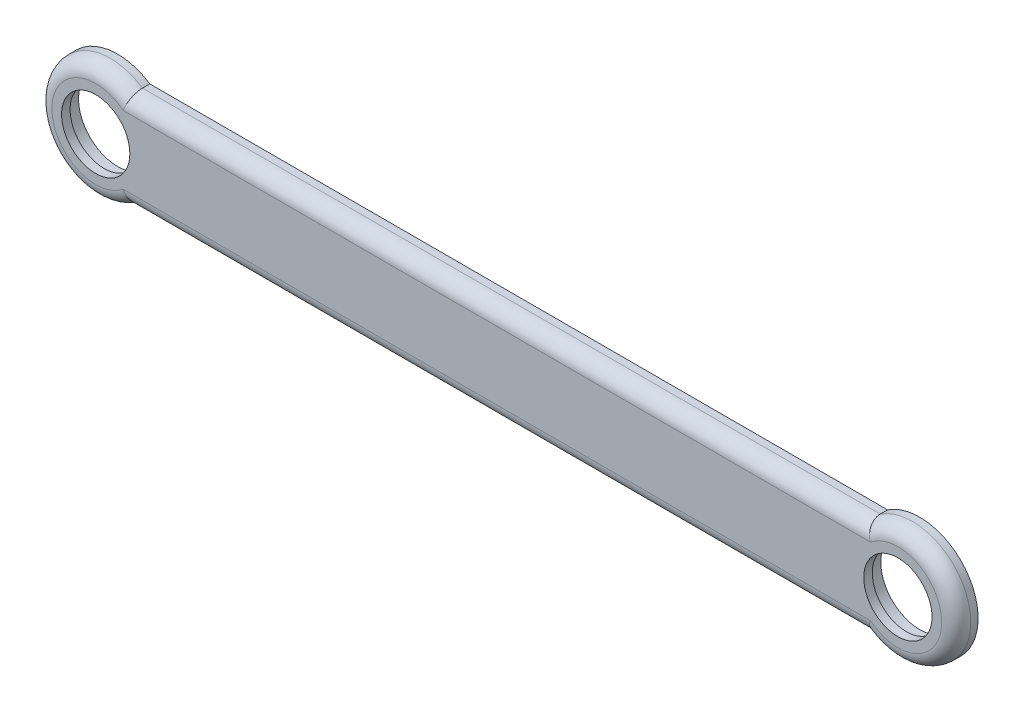
ISO-10303-21;
HEADER;
FILE_DESCRIPTION(('STEP AP214'),'2;1');
FILE_NAME('part.step','',(''),(''),'','','');
FILE_SCHEMA(('AUTOMOTIVE_DESIGN { 1 0 10303 214 1 1 1 1 }'));
ENDSEC;
DATA;
#1=APPLICATION_CONTEXT('core data for automotive mechanical design processes');
#2=APPLICATION_PROTOCOL_DEFINITION('international standard','automotive_design',2000,#1);
#3=PRODUCT_CONTEXT('',#1,'mechanical');
#4=PRODUCT('Part','Part','',(#3));
#5=PRODUCT_RELATED_PRODUCT_CATEGORY('part','',(#4));
#6=PRODUCT_DEFINITION_FORMATION('','',#4);
#7=PRODUCT_DEFINITION_CONTEXT('part definition',#1,'design');
#8=PRODUCT_DEFINITION('design','',#6,#7);
#9=PRODUCT_DEFINITION_SHAPE('','',#8);
#10=(LENGTH_UNIT() NAMED_UNIT(*) SI_UNIT(.MILLI.,.METRE.));
#11=(NAMED_UNIT(*) PLANE_ANGLE_UNIT() SI_UNIT($,.RADIAN.));
#12=(NAMED_UNIT(*) SI_UNIT($,.STERADIAN.) SOLID_ANGLE_UNIT());
#13=UNCERTAINTY_MEASURE_WITH_UNIT(LENGTH_MEASURE(1.E-05),#10,'distance_accuracy_value','');
#14=(GEOMETRIC_REPRESENTATION_CONTEXT(3) GLOBAL_UNCERTAINTY_ASSIGNED_CONTEXT((#13)) GLOBAL_UNIT_ASSIGNED_CONTEXT((#10,
#11,#12)) REPRESENTATION_CONTEXT('',''));
#15=CARTESIAN_POINT('',(0.,0.,0.));
#16=DIRECTION('',(0.,0.,1.));
#17=DIRECTION('',(1.,0.,0.));
#18=AXIS2_PLACEMENT_3D('',#15,#16,#17);
#19=CARTESIAN_POINT('',(0.,0.,0.));
#20=DIRECTION('',(0.,0.,1.));
#21=DIRECTION('',(1.,0.,0.));
#22=AXIS2_PLACEMENT_3D('',#19,#20,#21);
#23=PLANE('',#22);
#24=CARTESIAN_POINT('',(165.,0.,0.));
#25=DIRECTION('',(0.,0.,1.));
#26=DIRECTION('',(1.,0.,0.));
#27=AXIS2_PLACEMENT_3D('',#24,#25,#26);
#28=CIRCLE('',#27,8.025);
#29=CARTESIAN_POINT('',(173.025,0.,0.));
#30=VERTEX_POINT('',#29);
#31=EDGE_CURVE('E175',#30,#30,#28,.F.);
#32=ORIENTED_EDGE('',*,*,#31,.F.);
#33=EDGE_LOOP('',(#32));
#34=FACE_BOUND('',#33,.T.);
#35=CARTESIAN_POINT('',(0.,0.,0.));
#36=DIRECTION('',(0.,0.,1.));
#37=DIRECTION('',(1.,0.,0.));
#38=AXIS2_PLACEMENT_3D('',#35,#36,#37);
#39=CIRCLE('',#38,8.025);
#40=CARTESIAN_POINT('',(8.025,0.,0.));
#41=VERTEX_POINT('',#40);
#42=EDGE_CURVE('E11',#41,#41,#39,.T.);
#43=ORIENTED_EDGE('',*,*,#42,.T.);
#44=EDGE_LOOP('',(#43));
#45=FACE_BOUND('',#44,.T.);
#46=DIRECTION('',(1.,0.,0.));
#47=VECTOR('',#46,1.);
#48=CARTESIAN_POINT('',(6.6332495807108,10.,0.));
#49=LINE('',#48,#47);
#50=CARTESIAN_POINT('',(6.6332495807108,10.,0.));
#51=VERTEX_POINT('',#50);
#52=CARTESIAN_POINT('',(158.366750419289,10.,0.));
#53=VERTEX_POINT('',#52);
#54=EDGE_CURVE('E51',#51,#53,#49,.T.);
#55=ORIENTED_EDGE('',*,*,#54,.T.);
#56=CARTESIAN_POINT('',(165.,0.,0.));
#57=DIRECTION('',(0.,0.,1.));
#58=DIRECTION('',(1.,0.,0.));
#59=AXIS2_PLACEMENT_3D('',#56,#57,#58);
#60=CIRCLE('',#59,12.);
#61=CARTESIAN_POINT('',(158.366750419289,-10.,0.));
#62=VERTEX_POINT('',#61);
#63=EDGE_CURVE('E56',#53,#62,#60,.F.);
#64=ORIENTED_EDGE('',*,*,#63,.T.);
#65=DIRECTION('',(1.,0.,0.));
#66=VECTOR('',#65,1.);
#67=CARTESIAN_POINT('',(6.6332495807108,-10.,0.));
#68=LINE('',#67,#66);
#69=CARTESIAN_POINT('',(6.6332495807108,-10.,0.));
#70=VERTEX_POINT('',#69);
#71=EDGE_CURVE('E172',#70,#62,#68,.T.);
#72=ORIENTED_EDGE('',*,*,#71,.F.);
#73=CARTESIAN_POINT('',(0.,0.,0.));
#74=DIRECTION('',(0.,0.,1.));
#75=DIRECTION('',(1.,0.,0.));
#76=AXIS2_PLACEMENT_3D('',#73,#74,#75);
#77=CIRCLE('',#76,12.);
#78=EDGE_CURVE('E46',#51,#70,#77,.T.);
#79=ORIENTED_EDGE('',*,*,#78,.F.);
#80=EDGE_LOOP('',(#55,#64,#72,#79));
#81=FACE_BOUND('',#80,.T.);
#82=ADVANCED_FACE('F43',(#34,#45,#81),#23,.F.);
#83=CARTESIAN_POINT('',(0.,0.,4.5));
#84=DIRECTION('',(0.,0.,1.));
#85=DIRECTION('',(1.,0.,0.));
#86=AXIS2_PLACEMENT_3D('',#83,#84,#85);
#87=PLANE('',#86);
#88=CARTESIAN_POINT('',(0.,0.,4.5));
#89=DIRECTION('',(0.,0.,1.));
#90=DIRECTION('',(1.,0.,0.));
#91=AXIS2_PLACEMENT_3D('',#88,#89,#90);
#92=CIRCLE('',#91,9.);
#93=CARTESIAN_POINT('',(5.65685424949238,7.,4.5));
#94=VERTEX_POINT('',#93);
#95=CARTESIAN_POINT('',(5.65685424949238,-7.,4.5));
#96=VERTEX_POINT('',#95);
#97=EDGE_CURVE('E195',#94,#96,#92,.T.);
#98=ORIENTED_EDGE('',*,*,#97,.T.);
#99=DIRECTION('',(1.,0.,0.));
#100=VECTOR('',#99,1.);
#101=CARTESIAN_POINT('',(158.366750419289,-7.00000000000002,4.5));
#102=LINE('',#101,#100);
#103=CARTESIAN_POINT('',(159.343145750508,-7.00000000000001,4.5));
#104=VERTEX_POINT('',#103);
#105=EDGE_CURVE('E126',#96,#104,#102,.T.);
#106=ORIENTED_EDGE('',*,*,#105,.T.);
#107=CARTESIAN_POINT('',(165.,0.,4.5));
#108=DIRECTION('',(0.,0.,1.));
#109=DIRECTION('',(1.,0.,0.));
#110=AXIS2_PLACEMENT_3D('',#107,#108,#109);
#111=CIRCLE('',#110,9.00000000000003);
#112=CARTESIAN_POINT('',(159.343145750508,7.00000000000002,4.5));
#113=VERTEX_POINT('',#112);
#114=EDGE_CURVE('E192',#104,#113,#111,.T.);
#115=ORIENTED_EDGE('',*,*,#114,.T.);
#116=DIRECTION('',(1.,0.,0.));
#117=VECTOR('',#116,1.);
#118=CARTESIAN_POINT('',(0.,7.,4.5));
#119=LINE('',#118,#117);
#120=EDGE_CURVE('E188',#113,#94,#119,.F.);
#121=ORIENTED_EDGE('',*,*,#120,.T.);
#122=EDGE_LOOP('',(#98,#106,#115,#121));
#123=FACE_BOUND('',#122,.T.);
#124=CARTESIAN_POINT('',(165.,0.,4.5));
#125=DIRECTION('',(0.,0.,-1.));
#126=DIRECTION('',(-1.,0.,0.));
#127=AXIS2_PLACEMENT_3D('',#124,#125,#126);
#128=CIRCLE('',#127,7.025);
#129=CARTESIAN_POINT('',(157.975,0.,4.5));
#130=VERTEX_POINT('',#129);
#131=EDGE_CURVE('E168',#130,#130,#128,.T.);
#132=ORIENTED_EDGE('',*,*,#131,.T.);
#133=EDGE_LOOP('',(#132));
#134=FACE_BOUND('',#133,.T.);
#135=CARTESIAN_POINT('',(0.,0.,4.5));
#136=DIRECTION('',(0.,0.,1.));
#137=DIRECTION('',(1.,0.,0.));
#138=AXIS2_PLACEMENT_3D('',#135,#136,#137);
#139=CIRCLE('',#138,7.025);
#140=CARTESIAN_POINT('',(7.025,0.,4.5));
#141=VERTEX_POINT('',#140);
#142=EDGE_CURVE('E214',#141,#141,#139,.T.);
#143=ORIENTED_EDGE('',*,*,#142,.F.);
#144=EDGE_LOOP('',(#143));
#145=FACE_BOUND('',#144,.T.);
#146=ADVANCED_FACE('F193',(#123,#134,#145),#87,.T.);
#147=CARTESIAN_POINT('',(0.,0.,4.5));
#148=DIRECTION('',(0.,0.,-1.));
#149=DIRECTION('',(-1.,0.,0.));
#150=AXIS2_PLACEMENT_3D('',#147,#148,#149);
#151=CYLINDRICAL_SURFACE('',#150,12.);
#152=DIRECTION('',(0.,0.,-1.));
#153=VECTOR('',#152,1.);
#154=CARTESIAN_POINT('',(6.6332495807108,10.,4.5));
#155=LINE('',#154,#153);
#156=CARTESIAN_POINT('',(6.6332495807108,10.,1.5));
#157=VERTEX_POINT('',#156);
#158=EDGE_CURVE('E183',#157,#51,#155,.T.);
#159=ORIENTED_EDGE('',*,*,#158,.T.);
#160=ORIENTED_EDGE('',*,*,#78,.T.);
#161=DIRECTION('',(0.,0.,-1.));
#162=VECTOR('',#161,1.);
#163=CARTESIAN_POINT('',(6.6332495807108,-10.,4.5));
#164=LINE('',#163,#162);
#165=CARTESIAN_POINT('',(6.6332495807108,-10.,1.5));
#166=VERTEX_POINT('',#165);
#167=EDGE_CURVE('E105',#166,#70,#164,.T.);
#168=ORIENTED_EDGE('',*,*,#167,.F.);
#169=CARTESIAN_POINT('',(0.,0.,1.5));
#170=DIRECTION('',(0.,0.,1.));
#171=DIRECTION('',(1.,0.,0.));
#172=AXIS2_PLACEMENT_3D('',#169,#170,#171);
#173=CIRCLE('',#172,12.);
#174=EDGE_CURVE('E106',#166,#157,#173,.F.);
#175=ORIENTED_EDGE('',*,*,#174,.T.);
#176=EDGE_LOOP('',(#159,#160,#168,#175));
#177=FACE_BOUND('',#176,.T.);
#178=ADVANCED_FACE('F113',(#177),#151,.T.);
#179=CARTESIAN_POINT('',(6.6332495807108,-10.,4.5));
#180=DIRECTION('',(0.,1.,0.));
#181=DIRECTION('',(-1.,0.,0.));
#182=AXIS2_PLACEMENT_3D('',#179,#180,#181);
#183=PLANE('',#182);
#184=ORIENTED_EDGE('',*,*,#167,.T.);
#185=ORIENTED_EDGE('',*,*,#71,.T.);
#186=DIRECTION('',(0.,0.,-1.));
#187=VECTOR('',#186,1.);
#188=CARTESIAN_POINT('',(158.366750419289,-10.,4.5));
#189=LINE('',#188,#187);
#190=CARTESIAN_POINT('',(158.366750419289,-10.,1.5));
#191=VERTEX_POINT('',#190);
#192=EDGE_CURVE('E104',#191,#62,#189,.T.);
#193=ORIENTED_EDGE('',*,*,#192,.F.);
#194=DIRECTION('',(1.,0.,0.));
#195=VECTOR('',#194,1.);
#196=CARTESIAN_POINT('',(6.6332495807108,-10.,1.5));
#197=LINE('',#196,#195);
#198=EDGE_CURVE('E98',#191,#166,#197,.F.);
#199=ORIENTED_EDGE('',*,*,#198,.T.);
#200=EDGE_LOOP('',(#184,#185,#193,#199));
#201=FACE_BOUND('',#200,.T.);
#202=ADVANCED_FACE('F102',(#201),#183,.F.);
#203=CARTESIAN_POINT('',(165.,0.,4.5));
#204=DIRECTION('',(0.,0.,-1.));
#205=DIRECTION('',(-1.,0.,0.));
#206=AXIS2_PLACEMENT_3D('',#203,#204,#205);
#207=CYLINDRICAL_SURFACE('',#206,12.);
#208=ORIENTED_EDGE('',*,*,#63,.F.);
#209=DIRECTION('',(0.,0.,-1.));
#210=VECTOR('',#209,1.);
#211=CARTESIAN_POINT('',(158.366750419289,10.,4.5));
#212=LINE('',#211,#210);
#213=CARTESIAN_POINT('',(158.366750419289,10.,1.5));
#214=VERTEX_POINT('',#213);
#215=EDGE_CURVE('E181',#214,#53,#212,.T.);
#216=ORIENTED_EDGE('',*,*,#215,.F.);
#217=CARTESIAN_POINT('',(165.,0.,1.5));
#218=DIRECTION('',(0.,0.,1.));
#219=DIRECTION('',(1.,0.,0.));
#220=AXIS2_PLACEMENT_3D('',#217,#218,#219);
#221=CIRCLE('',#220,12.);
#222=EDGE_CURVE('E179',#214,#191,#221,.F.);
#223=ORIENTED_EDGE('',*,*,#222,.T.);
#224=ORIENTED_EDGE('',*,*,#192,.T.);
#225=EDGE_LOOP('',(#208,#216,#223,#224));
#226=FACE_BOUND('',#225,.T.);
#227=ADVANCED_FACE('F178',(#226),#207,.T.);
#228=CARTESIAN_POINT('',(6.6332495807108,10.,4.5));
#229=DIRECTION('',(0.,1.,0.));
#230=DIRECTION('',(-1.,0.,0.));
#231=AXIS2_PLACEMENT_3D('',#228,#229,#230);
#232=PLANE('',#231);
#233=ORIENTED_EDGE('',*,*,#54,.F.);
#234=ORIENTED_EDGE('',*,*,#158,.F.);
#235=DIRECTION('',(1.,0.,0.));
#236=VECTOR('',#235,1.);
#237=CARTESIAN_POINT('',(6.6332495807108,10.,1.5));
#238=LINE('',#237,#236);
#239=EDGE_CURVE('E110',#157,#214,#238,.T.);
#240=ORIENTED_EDGE('',*,*,#239,.T.);
#241=ORIENTED_EDGE('',*,*,#215,.T.);
#242=EDGE_LOOP('',(#233,#234,#240,#241));
#243=FACE_BOUND('',#242,.T.);
#244=ADVANCED_FACE('F202',(#243),#232,.T.);
#245=CARTESIAN_POINT('',(165.,0.,4.5));
#246=DIRECTION('',(0.,0.,-1.));
#247=DIRECTION('',(-1.,0.,0.));
#248=AXIS2_PLACEMENT_3D('',#245,#246,#247);
#249=CYLINDRICAL_SURFACE('',#248,7.025);
#250=CARTESIAN_POINT('',(165.,0.,2.75));
#251=DIRECTION('',(0.,0.,-1.));
#252=DIRECTION('',(-1.,0.,0.));
#253=AXIS2_PLACEMENT_3D('',#250,#251,#252);
#254=CIRCLE('',#253,7.025);
#255=CARTESIAN_POINT('',(157.975,0.,2.75));
#256=VERTEX_POINT('',#255);
#257=EDGE_CURVE('E212',#256,#256,#254,.T.);
#258=ORIENTED_EDGE('',*,*,#257,.T.);
#259=EDGE_LOOP('',(#258));
#260=FACE_BOUND('',#259,.T.);
#261=ORIENTED_EDGE('',*,*,#131,.F.);
#262=EDGE_LOOP('',(#261));
#263=FACE_BOUND('',#262,.T.);
#264=ADVANCED_FACE('F238',(#260,#263),#249,.F.);
#265=CARTESIAN_POINT('',(0.,0.,4.5));
#266=DIRECTION('',(0.,0.,-1.));
#267=DIRECTION('',(-1.,0.,0.));
#268=AXIS2_PLACEMENT_3D('',#265,#266,#267);
#269=CYLINDRICAL_SURFACE('',#268,7.025);
#270=ORIENTED_EDGE('',*,*,#142,.T.);
#271=EDGE_LOOP('',(#270));
#272=FACE_BOUND('',#271,.T.);
#273=CARTESIAN_POINT('',(0.,0.,2.75));
#274=DIRECTION('',(0.,0.,1.));
#275=DIRECTION('',(1.,0.,0.));
#276=AXIS2_PLACEMENT_3D('',#273,#274,#275);
#277=CIRCLE('',#276,7.025);
#278=CARTESIAN_POINT('',(7.025,0.,2.75));
#279=VERTEX_POINT('',#278);
#280=EDGE_CURVE('E210',#279,#279,#277,.F.);
#281=ORIENTED_EDGE('',*,*,#280,.T.);
#282=EDGE_LOOP('',(#281));
#283=FACE_BOUND('',#282,.T.);
#284=ADVANCED_FACE('F221',(#272,#283),#269,.F.);
#285=CARTESIAN_POINT('',(165.,0.,2.75));
#286=DIRECTION('',(0.,0.,-1.));
#287=DIRECTION('',(-1.,0.,0.));
#288=AXIS2_PLACEMENT_3D('',#285,#286,#287);
#289=CYLINDRICAL_SURFACE('',#288,8.025);
#290=ORIENTED_EDGE('',*,*,#31,.T.);
#291=EDGE_LOOP('',(#290));
#292=FACE_BOUND('',#291,.T.);
#293=CARTESIAN_POINT('',(165.,0.,2.75));
#294=DIRECTION('',(0.,0.,-1.));
#295=DIRECTION('',(-1.,0.,0.));
#296=AXIS2_PLACEMENT_3D('',#293,#294,#295);
#297=CIRCLE('',#296,8.025);
#298=CARTESIAN_POINT('',(156.975,0.,2.75));
#299=VERTEX_POINT('',#298);
#300=EDGE_CURVE('E204',#299,#299,#297,.T.);
#301=ORIENTED_EDGE('',*,*,#300,.F.);
#302=EDGE_LOOP('',(#301));
#303=FACE_BOUND('',#302,.T.);
#304=ADVANCED_FACE('F265',(#292,#303),#289,.F.);
#305=CARTESIAN_POINT('',(165.,0.,2.75));
#306=DIRECTION('',(0.,0.,-1.));
#307=DIRECTION('',(-1.,0.,0.));
#308=AXIS2_PLACEMENT_3D('',#305,#306,#307);
#309=PLANE('',#308);
#310=ORIENTED_EDGE('',*,*,#257,.F.);
#311=EDGE_LOOP('',(#310));
#312=FACE_BOUND('',#311,.T.);
#313=ORIENTED_EDGE('',*,*,#300,.T.);
#314=EDGE_LOOP('',(#313));
#315=FACE_BOUND('',#314,.T.);
#316=ADVANCED_FACE('F237',(#312,#315),#309,.T.);
#317=CARTESIAN_POINT('',(0.,0.,2.75));
#318=DIRECTION('',(0.,0.,-1.));
#319=DIRECTION('',(-1.,0.,0.));
#320=AXIS2_PLACEMENT_3D('',#317,#318,#319);
#321=CYLINDRICAL_SURFACE('',#320,8.025);
#322=ORIENTED_EDGE('',*,*,#42,.F.);
#323=EDGE_LOOP('',(#322));
#324=FACE_BOUND('',#323,.T.);
#325=CARTESIAN_POINT('',(0.,0.,2.75));
#326=DIRECTION('',(0.,0.,1.));
#327=DIRECTION('',(1.,0.,0.));
#328=AXIS2_PLACEMENT_3D('',#325,#326,#327);
#329=CIRCLE('',#328,8.025);
#330=CARTESIAN_POINT('',(8.025,0.,2.75));
#331=VERTEX_POINT('',#330);
#332=EDGE_CURVE('E205',#331,#331,#329,.T.);
#333=ORIENTED_EDGE('',*,*,#332,.T.);
#334=EDGE_LOOP('',(#333));
#335=FACE_BOUND('',#334,.T.);
#336=ADVANCED_FACE('F275',(#324,#335),#321,.F.);
#337=CARTESIAN_POINT('',(0.,0.,2.75));
#338=DIRECTION('',(0.,0.,1.));
#339=DIRECTION('',(1.,0.,0.));
#340=AXIS2_PLACEMENT_3D('',#337,#338,#339);
#341=PLANE('',#340);
#342=ORIENTED_EDGE('',*,*,#280,.F.);
#343=EDGE_LOOP('',(#342));
#344=FACE_BOUND('',#343,.T.);
#345=ORIENTED_EDGE('',*,*,#332,.F.);
#346=EDGE_LOOP('',(#345));
#347=FACE_BOUND('',#346,.T.);
#348=ADVANCED_FACE('F274',(#344,#347),#341,.F.);
#349=CARTESIAN_POINT('',(165.,0.,1.5));
#350=DIRECTION('',(0.,0.,1.));
#351=DIRECTION('',(1.,0.,0.));
#352=AXIS2_PLACEMENT_3D('',#349,#350,#351);
#353=TOROIDAL_SURFACE('',#352,9.00000000000003,3.);
#354=CARTESIAN_POINT('',(158.366750419289,-10.,1.5));
#355=CARTESIAN_POINT('',(158.366748406548,-10.0000098535692,1.58167717188771));
#356=CARTESIAN_POINT('',(158.367756119082,-9.99666455428936,1.66334955424276));
#357=CARTESIAN_POINT('',(158.371775128652,-9.98333938667463,1.82609183130196));
#358=CARTESIAN_POINT('',(158.374786177691,-9.97336033954348,1.90716179932415));
#359=CARTESIAN_POINT('',(158.382788912227,-9.94686684749292,2.06798438045933));
#360=CARTESIAN_POINT('',(158.387777082286,-9.93036400241241,2.14773907145089));
#361=CARTESIAN_POINT('',(158.399698197228,-9.89098718371105,2.30548849774177));
#362=CARTESIAN_POINT('',(158.406631146236,-9.86811319658087,2.38348322930889));
#363=CARTESIAN_POINT('',(158.430293603664,-9.79019724346064,2.6140229760547));
#364=CARTESIAN_POINT('',(158.449893121657,-9.72583993009606,2.76325176013138));
#365=CARTESIAN_POINT('',(158.496248267667,-9.57456313707387,3.04846076672712));
#366=CARTESIAN_POINT('',(158.523004457229,-9.48764188696214,3.18443994847892));
#367=CARTESIAN_POINT('',(158.583564045909,-9.29243006025774,3.44197958183514));
#368=CARTESIAN_POINT('',(158.617476361481,-9.18381078859014,3.56326534366037));
#369=CARTESIAN_POINT('',(158.691315052031,-8.9495361347456,3.78592345680368));
#370=CARTESIAN_POINT('',(158.731243217371,-8.82387568210235,3.88728985920836));
#371=CARTESIAN_POINT('',(158.817979114909,-8.55385703409445,4.07163781091404));
#372=CARTESIAN_POINT('',(158.864999363909,-8.40894912932895,4.1537129721208));
#373=CARTESIAN_POINT('',(158.963614617624,-8.10888057219527,4.29243553794698));
#374=CARTESIAN_POINT('',(159.015209767454,-7.95371959463985,4.34908213562769));
#375=CARTESIAN_POINT('',(159.11169754666,-7.66755910857492,4.42780386846399));
#376=CARTESIAN_POINT('',(159.155999727501,-7.53757385301958,4.45440399544497));
#377=CARTESIAN_POINT('',(159.246227202724,-7.27596866612548,4.49018587534928));
#378=CARTESIAN_POINT('',(159.292149241296,-7.14435232413626,4.49940074278481));
#379=CARTESIAN_POINT('',(159.340075831448,-7.0086847995247,4.49999059500399));
#380=CARTESIAN_POINT('',(159.341610540671,-7.00434221800044,4.50000002380911));
#381=CARTESIAN_POINT('',(159.343145750508,-7.00000000000002,4.5));
#382=B_SPLINE_CURVE_WITH_KNOTS('',3,(#354,#355,#356,#357,#358,#359,#360,#361,#362,#363,#364,
#365,#366,#367,#368,#369,#370,#371,#372,#373,#374,#375,#376,#377,#378,#379,#380,#381),
.UNSPECIFIED.,.F.,.F.,(4,2,2,2,2,2,2,2,2,2,2,2,2,4),(0.,0.244948450351612,0.489866583732242,
0.734351177670228,0.978836290015571,1.46742101818896,1.95604409421152,2.45272325799537,
2.94955053024501,3.46641584921098,3.98329756899188,4.40191800726716,4.81974027154333,
4.83355763866565),.UNSPECIFIED.);
#383=EDGE_CURVE('E131',#191,#104,#382,.T.);
#384=ORIENTED_EDGE('',*,*,#383,.F.);
#385=ORIENTED_EDGE('',*,*,#222,.F.);
#386=CARTESIAN_POINT('',(158.366750419289,10.,1.5));
#387=CARTESIAN_POINT('',(158.366748406548,10.0000098535692,1.58167717188771));
#388=CARTESIAN_POINT('',(158.367756119082,9.99666455428936,1.66334955424276));
#389=CARTESIAN_POINT('',(158.371775128652,9.98333938667463,1.82609183130196));
#390=CARTESIAN_POINT('',(158.374786177691,9.97336033954348,1.90716179932415));
#391=CARTESIAN_POINT('',(158.382788912227,9.94686684749292,2.06798438045933));
#392=CARTESIAN_POINT('',(158.387777082286,9.93036400241241,2.14773907145089));
#393=CARTESIAN_POINT('',(158.399698197228,9.89098718371105,2.30548849774177));
#394=CARTESIAN_POINT('',(158.406631146236,9.86811319658087,2.38348322930889));
#395=CARTESIAN_POINT('',(158.430293603664,9.79019724346064,2.6140229760547));
#396=CARTESIAN_POINT('',(158.449893121657,9.72583993009606,2.76325176013137));
#397=CARTESIAN_POINT('',(158.496248267667,9.57456313707387,3.04846076672712));
#398=CARTESIAN_POINT('',(158.523004457229,9.48764188696214,3.18443994847892));
#399=CARTESIAN_POINT('',(158.583564045909,9.29243006025774,3.44197958183514));
#400=CARTESIAN_POINT('',(158.617476361481,9.18381078859014,3.56326534366037));
#401=CARTESIAN_POINT('',(158.691315052031,8.9495361347456,3.78592345680368));
#402=CARTESIAN_POINT('',(158.731243217371,8.82387568210235,3.88728985920836));
#403=CARTESIAN_POINT('',(158.817979114909,8.55385703409445,4.07163781091404));
#404=CARTESIAN_POINT('',(158.864999363909,8.40894912932895,4.1537129721208));
#405=CARTESIAN_POINT('',(158.963614617624,8.10888057219527,4.29243553794698));
#406=CARTESIAN_POINT('',(159.015209767454,7.95371959463985,4.34908213562769));
#407=CARTESIAN_POINT('',(159.11169754666,7.66755910857492,4.42780386846399));
#408=CARTESIAN_POINT('',(159.155999727501,7.53757385301958,4.45440399544497));
#409=CARTESIAN_POINT('',(159.246227202724,7.27596866612548,4.49018587534928));
#410=CARTESIAN_POINT('',(159.292149241296,7.14435232413626,4.49940074278481));
#411=CARTESIAN_POINT('',(159.340075831448,7.0086847995247,4.49999059500399));
#412=CARTESIAN_POINT('',(159.341610540671,7.00434221800044,4.50000002380911));
#413=CARTESIAN_POINT('',(159.343145750508,7.00000000000002,4.5));
#414=B_SPLINE_CURVE_WITH_KNOTS('',3,(#386,#387,#388,#389,#390,#391,#392,#393,#394,#395,#396,
#397,#398,#399,#400,#401,#402,#403,#404,#405,#406,#407,#408,#409,#410,#411,#412,#413),
.UNSPECIFIED.,.F.,.F.,(4,2,2,2,2,2,2,2,2,2,2,2,2,4),(0.,0.244948450351612,0.489866583732242,
0.734351177670228,0.97883629001557,1.46742101818896,1.95604409421152,2.45272325799537,
2.94955053024501,3.46641584921098,3.98329756899188,4.40191800726715,4.81974027154332,
4.83355763866565),.UNSPECIFIED.);
#415=EDGE_CURVE('E158',#113,#214,#414,.F.);
#416=ORIENTED_EDGE('',*,*,#415,.F.);
#417=ORIENTED_EDGE('',*,*,#114,.F.);
#418=EDGE_LOOP('',(#384,#385,#416,#417));
#419=FACE_BOUND('',#418,.T.);
#420=ADVANCED_FACE('F153',(#419),#353,.T.);
#421=CARTESIAN_POINT('',(6.6332495807108,7.,1.5));
#422=DIRECTION('',(1.,0.,0.));
#423=DIRECTION('',(0.,1.,0.));
#424=AXIS2_PLACEMENT_3D('',#421,#422,#423);
#425=CYLINDRICAL_SURFACE('',#424,3.);
#426=ORIENTED_EDGE('',*,*,#415,.T.);
#427=ORIENTED_EDGE('',*,*,#239,.F.);
#428=CARTESIAN_POINT('',(6.6332495807108,10.,1.5));
#429=CARTESIAN_POINT('',(6.63325159345219,10.0000098535691,1.58167717188771));
#430=CARTESIAN_POINT('',(6.63224388091785,9.99666455428934,1.66334955424276));
#431=CARTESIAN_POINT('',(6.62822487134797,9.98333938667461,1.82609183130196));
#432=CARTESIAN_POINT('',(6.62521382230908,9.97336033954346,1.90716179932415));
#433=CARTESIAN_POINT('',(6.61721108777259,9.9468668474929,2.06798438045933));
#434=CARTESIAN_POINT('',(6.61222291771409,9.93036400241239,2.14773907145089));
#435=CARTESIAN_POINT('',(6.60030180277157,9.89098718371103,2.30548849774177));
#436=CARTESIAN_POINT('',(6.59336885376385,9.86811319658085,2.38348322930889));
#437=CARTESIAN_POINT('',(6.56970639633649,9.79019724346062,2.6140229760547));
#438=CARTESIAN_POINT('',(6.55010687834284,9.72583993009604,2.76325176013138));
#439=CARTESIAN_POINT('',(6.50375173233288,9.57456313707385,3.04846076672712));
#440=CARTESIAN_POINT('',(6.47699554277131,9.48764188696212,3.18443994847892));
#441=CARTESIAN_POINT('',(6.41643595409055,9.29243006025772,3.44197958183514));
#442=CARTESIAN_POINT('',(6.38252363851867,9.18381078859012,3.56326534366037));
#443=CARTESIAN_POINT('',(6.30868494796898,8.94953613474558,3.78592345680368));
#444=CARTESIAN_POINT('',(6.26875678262947,8.82387568210233,3.88728985920836));
#445=CARTESIAN_POINT('',(6.18202088509073,8.55385703409443,4.07163781091404));
#446=CARTESIAN_POINT('',(6.13500063609103,8.40894912932893,4.1537129721208));
#447=CARTESIAN_POINT('',(6.03638538237641,8.10888057219525,4.29243553794698));
#448=CARTESIAN_POINT('',(5.98479023254583,7.95371959463982,4.34908213562768));
#449=CARTESIAN_POINT('',(5.88830245333968,7.6675591085749,4.42780386846399));
#450=CARTESIAN_POINT('',(5.84400027249901,7.53757385301957,4.45440399544497));
#451=CARTESIAN_POINT('',(5.75377279727607,7.27596866612543,4.49018587534929));
#452=CARTESIAN_POINT('',(5.70785075870412,7.14435232413617,4.49940074278481));
#453=CARTESIAN_POINT('',(5.65992416855214,7.00868479952467,4.49999059500399));
#454=CARTESIAN_POINT('',(5.6583894593291,7.00434221800042,4.50000002380911));
#455=CARTESIAN_POINT('',(5.65685424949238,7.,4.5));
#456=B_SPLINE_CURVE_WITH_KNOTS('',3,(#428,#429,#430,#431,#432,#433,#434,#435,#436,#437,#438,
#439,#440,#441,#442,#443,#444,#445,#446,#447,#448,#449,#450,#451,#452,#453,#454,#455),
.UNSPECIFIED.,.F.,.F.,(4,2,2,2,2,2,2,2,2,2,2,2,2,4),(0.,0.244948450351612,0.489866583732243,
0.734351177670228,0.97883629001557,1.46742101818897,1.95604409421152,2.45272325799537,
2.94955053024501,3.46641584921098,3.98329756899188,4.40191800726716,4.81974027154333,
4.83355763866565),.UNSPECIFIED.);
#457=EDGE_CURVE('E125',#94,#157,#456,.F.);
#458=ORIENTED_EDGE('',*,*,#457,.F.);
#459=ORIENTED_EDGE('',*,*,#120,.F.);
#460=EDGE_LOOP('',(#426,#427,#458,#459));
#461=FACE_BOUND('',#460,.T.);
#462=ADVANCED_FACE('F152',(#461),#425,.T.);
#463=CARTESIAN_POINT('',(0.,-7.,1.5));
#464=DIRECTION('',(-1.,0.,0.));
#465=DIRECTION('',(0.,-1.,0.));
#466=AXIS2_PLACEMENT_3D('',#463,#464,#465);
#467=CYLINDRICAL_SURFACE('',#466,3.);
#468=ORIENTED_EDGE('',*,*,#383,.T.);
#469=ORIENTED_EDGE('',*,*,#105,.F.);
#470=CARTESIAN_POINT('',(6.6332495807108,-10.,1.5));
#471=CARTESIAN_POINT('',(6.63325159345219,-10.0000098535691,1.58167717188771));
#472=CARTESIAN_POINT('',(6.63224388091785,-9.99666455428934,1.66334955424276));
#473=CARTESIAN_POINT('',(6.62822487134797,-9.98333938667461,1.82609183130196));
#474=CARTESIAN_POINT('',(6.62521382230908,-9.97336033954346,1.90716179932415));
#475=CARTESIAN_POINT('',(6.61721108777259,-9.9468668474929,2.06798438045933));
#476=CARTESIAN_POINT('',(6.61222291771409,-9.93036400241239,2.14773907145089));
#477=CARTESIAN_POINT('',(6.60030180277157,-9.89098718371103,2.30548849774177));
#478=CARTESIAN_POINT('',(6.59336885376385,-9.86811319658085,2.38348322930889));
#479=CARTESIAN_POINT('',(6.56970639633649,-9.79019724346062,2.6140229760547));
#480=CARTESIAN_POINT('',(6.55010687834284,-9.72583993009605,2.76325176013138));
#481=CARTESIAN_POINT('',(6.50375173233288,-9.57456313707386,3.04846076672712));
#482=CARTESIAN_POINT('',(6.47699554277131,-9.48764188696212,3.18443994847892));
#483=CARTESIAN_POINT('',(6.41643595409055,-9.29243006025772,3.44197958183514));
#484=CARTESIAN_POINT('',(6.38252363851867,-9.18381078859012,3.56326534366037));
#485=CARTESIAN_POINT('',(6.30868494796898,-8.94953613474558,3.78592345680368));
#486=CARTESIAN_POINT('',(6.26875678262947,-8.82387568210233,3.88728985920836));
#487=CARTESIAN_POINT('',(6.18202088509073,-8.55385703409443,4.07163781091404));
#488=CARTESIAN_POINT('',(6.13500063609103,-8.40894912932893,4.1537129721208));
#489=CARTESIAN_POINT('',(6.0363853823764,-8.10888057219525,4.29243553794698));
#490=CARTESIAN_POINT('',(5.98479023254582,-7.95371959463982,4.34908213562769));
#491=CARTESIAN_POINT('',(5.88830245333968,-7.6675591085749,4.42780386846399));
#492=CARTESIAN_POINT('',(5.84400027249902,-7.53757385301957,4.45440399544497));
#493=CARTESIAN_POINT('',(5.75377279727606,-7.27596866612544,4.49018587534929));
#494=CARTESIAN_POINT('',(5.70785075870409,-7.14435232413618,4.49940074278481));
#495=CARTESIAN_POINT('',(5.65992416855214,-7.00868479952467,4.49999059500399));
#496=CARTESIAN_POINT('',(5.6583894593291,-7.00434221800042,4.50000002380911));
#497=CARTESIAN_POINT('',(5.65685424949238,-7.,4.5));
#498=B_SPLINE_CURVE_WITH_KNOTS('',3,(#470,#471,#472,#473,#474,#475,#476,#477,#478,#479,#480,
#481,#482,#483,#484,#485,#486,#487,#488,#489,#490,#491,#492,#493,#494,#495,#496,#497),
.UNSPECIFIED.,.F.,.F.,(4,2,2,2,2,2,2,2,2,2,2,2,2,4),(0.,0.244948450351612,0.489866583732243,
0.734351177670228,0.97883629001557,1.46742101818896,1.95604409421152,2.45272325799537,
2.94955053024501,3.46641584921098,3.98329756899188,4.40191800726716,4.81974027154333,
4.83355763866565),.UNSPECIFIED.);
#499=EDGE_CURVE('E123',#166,#96,#498,.T.);
#500=ORIENTED_EDGE('',*,*,#499,.F.);
#501=ORIENTED_EDGE('',*,*,#198,.F.);
#502=EDGE_LOOP('',(#468,#469,#500,#501));
#503=FACE_BOUND('',#502,.T.);
#504=ADVANCED_FACE('F130',(#503),#467,.T.);
#505=CARTESIAN_POINT('',(0.,0.,1.5));
#506=DIRECTION('',(0.,0.,1.));
#507=DIRECTION('',(1.,0.,0.));
#508=AXIS2_PLACEMENT_3D('',#505,#506,#507);
#509=TOROIDAL_SURFACE('',#508,9.,3.);
#510=ORIENTED_EDGE('',*,*,#457,.T.);
#511=ORIENTED_EDGE('',*,*,#174,.F.);
#512=ORIENTED_EDGE('',*,*,#499,.T.);
#513=ORIENTED_EDGE('',*,*,#97,.F.);
#514=EDGE_LOOP('',(#510,#511,#512,#513));
#515=FACE_BOUND('',#514,.T.);
#516=ADVANCED_FACE('F116',(#515),#509,.T.);
#517=CLOSED_SHELL('',(#82,#146,#178,#202,#227,#244,#264,#284,#304,#316,#336,#348,#420,#462,#504,#516));
#518=MANIFOLD_SOLID_BREP('B2',#517);
#519=ADVANCED_BREP_SHAPE_REPRESENTATION('',(#18,#518),#14);
#520=SHAPE_DEFINITION_REPRESENTATION(#9,#519);
ENDSEC;
END-ISO-10303-21;
